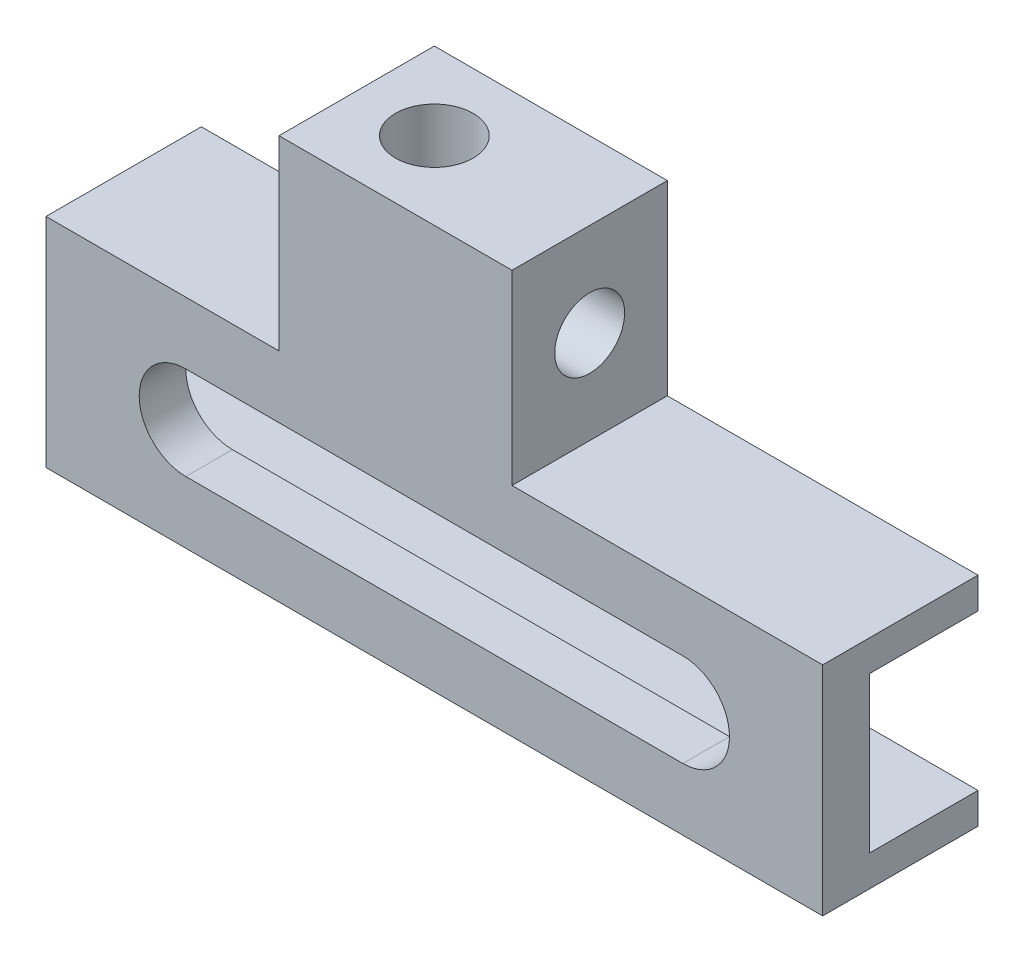
ISO-10303-21;
HEADER;
FILE_DESCRIPTION(('STEP AP214'),'2;1');
FILE_NAME('part.step','',(''),(''),'','','');
FILE_SCHEMA(('AUTOMOTIVE_DESIGN { 1 0 10303 214 1 1 1 1 }'));
ENDSEC;
DATA;
#1=APPLICATION_CONTEXT('core data for automotive mechanical design processes');
#2=APPLICATION_PROTOCOL_DEFINITION('international standard','automotive_design',2000,#1);
#3=PRODUCT_CONTEXT('',#1,'mechanical');
#4=PRODUCT('Part','Part','',(#3));
#5=PRODUCT_RELATED_PRODUCT_CATEGORY('part','',(#4));
#6=PRODUCT_DEFINITION_FORMATION('','',#4);
#7=PRODUCT_DEFINITION_CONTEXT('part definition',#1,'design');
#8=PRODUCT_DEFINITION('design','',#6,#7);
#9=PRODUCT_DEFINITION_SHAPE('','',#8);
#10=(LENGTH_UNIT() NAMED_UNIT(*) SI_UNIT(.MILLI.,.METRE.));
#11=(NAMED_UNIT(*) PLANE_ANGLE_UNIT() SI_UNIT($,.RADIAN.));
#12=(NAMED_UNIT(*) SI_UNIT($,.STERADIAN.) SOLID_ANGLE_UNIT());
#13=UNCERTAINTY_MEASURE_WITH_UNIT(LENGTH_MEASURE(1.E-05),#10,'distance_accuracy_value','');
#14=(GEOMETRIC_REPRESENTATION_CONTEXT(3) GLOBAL_UNCERTAINTY_ASSIGNED_CONTEXT((#13)) GLOBAL_UNIT_ASSIGNED_CONTEXT((#10,
#11,#12)) REPRESENTATION_CONTEXT('',''));
#15=CARTESIAN_POINT('',(0.,0.,0.));
#16=DIRECTION('',(0.,0.,1.));
#17=DIRECTION('',(1.,0.,0.));
#18=AXIS2_PLACEMENT_3D('',#15,#16,#17);
#19=CARTESIAN_POINT('',(50.,7.,0.));
#20=DIRECTION('',(0.,-1.,0.));
#21=DIRECTION('',(0.,0.,-1.));
#22=AXIS2_PLACEMENT_3D('',#19,#20,#21);
#23=PLANE('',#22);
#24=DIRECTION('',(0.,0.,1.));
#25=VECTOR('',#24,1.);
#26=CARTESIAN_POINT('',(15.,7.,-10.));
#27=LINE('',#26,#25);
#28=CARTESIAN_POINT('',(15.,7.,-10.));
#29=VERTEX_POINT('',#28);
#30=CARTESIAN_POINT('',(15.,7.,0.));
#31=VERTEX_POINT('',#30);
#32=EDGE_CURVE('E46',#29,#31,#27,.T.);
#33=ORIENTED_EDGE('',*,*,#32,.F.);
#34=DIRECTION('',(-1.,0.,0.));
#35=VECTOR('',#34,1.);
#36=CARTESIAN_POINT('',(50.,7.,-10.));
#37=LINE('',#36,#35);
#38=CARTESIAN_POINT('',(0.,7.,-10.));
#39=VERTEX_POINT('',#38);
#40=EDGE_CURVE('E219',#29,#39,#37,.T.);
#41=ORIENTED_EDGE('',*,*,#40,.T.);
#42=DIRECTION('',(0.,0.,1.));
#43=VECTOR('',#42,1.);
#44=CARTESIAN_POINT('',(0.,7.,0.));
#45=LINE('',#44,#43);
#46=CARTESIAN_POINT('',(0.,7.,0.));
#47=VERTEX_POINT('',#46);
#48=EDGE_CURVE('E194',#39,#47,#45,.T.);
#49=ORIENTED_EDGE('',*,*,#48,.T.);
#50=DIRECTION('',(-1.,0.,0.));
#51=VECTOR('',#50,1.);
#52=CARTESIAN_POINT('',(50.,7.,0.));
#53=LINE('',#52,#51);
#54=EDGE_CURVE('E39',#31,#47,#53,.T.);
#55=ORIENTED_EDGE('',*,*,#54,.F.);
#56=EDGE_LOOP('',(#33,#41,#49,#55));
#57=FACE_BOUND('',#56,.T.);
#58=ADVANCED_FACE('F32',(#57),#23,.F.);
#59=DIRECTION('',(0.,0.,-1.));
#60=VECTOR('',#59,1.);
#61=CARTESIAN_POINT('',(30.,7.,-10.));
#62=LINE('',#61,#60);
#63=CARTESIAN_POINT('',(30.,7.,0.));
#64=VERTEX_POINT('',#63);
#65=CARTESIAN_POINT('',(30.,7.,-10.));
#66=VERTEX_POINT('',#65);
#67=EDGE_CURVE('E160',#64,#66,#62,.T.);
#68=ORIENTED_EDGE('',*,*,#67,.F.);
#69=CARTESIAN_POINT('',(50.,7.,0.));
#70=VERTEX_POINT('',#69);
#71=EDGE_CURVE('E11',#70,#64,#53,.T.);
#72=ORIENTED_EDGE('',*,*,#71,.F.);
#73=DIRECTION('',(0.,0.,1.));
#74=VECTOR('',#73,1.);
#75=CARTESIAN_POINT('',(50.,7.,0.));
#76=LINE('',#75,#74);
#77=CARTESIAN_POINT('',(50.,7.,-10.));
#78=VERTEX_POINT('',#77);
#79=EDGE_CURVE('E201',#78,#70,#76,.T.);
#80=ORIENTED_EDGE('',*,*,#79,.F.);
#81=EDGE_CURVE('E235',#78,#66,#37,.T.);
#82=ORIENTED_EDGE('',*,*,#81,.T.);
#83=EDGE_LOOP('',(#68,#72,#80,#82));
#84=FACE_BOUND('',#83,.T.);
#85=ADVANCED_FACE('F305',(#84),#23,.F.);
#86=CARTESIAN_POINT('',(50.,-7.,0.));
#87=DIRECTION('',(0.,0.,-1.));
#88=DIRECTION('',(-1.,0.,0.));
#89=AXIS2_PLACEMENT_3D('',#86,#87,#88);
#90=PLANE('',#89);
#91=DIRECTION('',(1.,0.,0.));
#92=VECTOR('',#91,1.);
#93=CARTESIAN_POINT('',(41.,3.,0.));
#94=LINE('',#93,#92);
#95=CARTESIAN_POINT('',(9.,3.,0.));
#96=VERTEX_POINT('',#95);
#97=CARTESIAN_POINT('',(41.,3.,0.));
#98=VERTEX_POINT('',#97);
#99=EDGE_CURVE('E181',#96,#98,#94,.T.);
#100=ORIENTED_EDGE('',*,*,#99,.T.);
#101=CARTESIAN_POINT('',(41.,0.,0.));
#102=DIRECTION('',(0.,0.,-1.));
#103=DIRECTION('',(0.,1.,0.));
#104=AXIS2_PLACEMENT_3D('',#101,#102,#103);
#105=CIRCLE('',#104,3.);
#106=CARTESIAN_POINT('',(41.,-3.,0.));
#107=VERTEX_POINT('',#106);
#108=EDGE_CURVE('E171',#98,#107,#105,.T.);
#109=ORIENTED_EDGE('',*,*,#108,.T.);
#110=DIRECTION('',(-1.,0.,0.));
#111=VECTOR('',#110,1.);
#112=CARTESIAN_POINT('',(41.,-3.,0.));
#113=LINE('',#112,#111);
#114=CARTESIAN_POINT('',(9.,-3.,0.));
#115=VERTEX_POINT('',#114);
#116=EDGE_CURVE('E174',#107,#115,#113,.T.);
#117=ORIENTED_EDGE('',*,*,#116,.T.);
#118=CARTESIAN_POINT('',(9.,0.,0.));
#119=DIRECTION('',(0.,0.,-1.));
#120=DIRECTION('',(0.,1.,0.));
#121=AXIS2_PLACEMENT_3D('',#118,#119,#120);
#122=CIRCLE('',#121,3.);
#123=EDGE_CURVE('E178',#115,#96,#122,.T.);
#124=ORIENTED_EDGE('',*,*,#123,.T.);
#125=EDGE_LOOP('',(#100,#109,#117,#124));
#126=FACE_BOUND('',#125,.T.);
#127=DIRECTION('',(0.,-1.,0.));
#128=VECTOR('',#127,1.);
#129=CARTESIAN_POINT('',(0.,-7.,0.));
#130=LINE('',#129,#128);
#131=CARTESIAN_POINT('',(0.,-7.,0.));
#132=VERTEX_POINT('',#131);
#133=EDGE_CURVE('E221',#47,#132,#130,.T.);
#134=ORIENTED_EDGE('',*,*,#133,.T.);
#135=DIRECTION('',(-1.,0.,0.));
#136=VECTOR('',#135,1.);
#137=CARTESIAN_POINT('',(50.,-7.,0.));
#138=LINE('',#137,#136);
#139=CARTESIAN_POINT('',(50.,-7.,0.));
#140=VERTEX_POINT('',#139);
#141=EDGE_CURVE('E251',#140,#132,#138,.T.);
#142=ORIENTED_EDGE('',*,*,#141,.F.);
#143=DIRECTION('',(0.,-1.,0.));
#144=VECTOR('',#143,1.);
#145=CARTESIAN_POINT('',(50.,-7.,0.));
#146=LINE('',#145,#144);
#147=EDGE_CURVE('E204',#70,#140,#146,.T.);
#148=ORIENTED_EDGE('',*,*,#147,.F.);
#149=ORIENTED_EDGE('',*,*,#71,.T.);
#150=DIRECTION('',(0.,-1.,0.));
#151=VECTOR('',#150,1.);
#152=CARTESIAN_POINT('',(30.,19.,0.));
#153=LINE('',#152,#151);
#154=CARTESIAN_POINT('',(30.,19.,0.));
#155=VERTEX_POINT('',#154);
#156=EDGE_CURVE('E147',#155,#64,#153,.T.);
#157=ORIENTED_EDGE('',*,*,#156,.F.);
#158=DIRECTION('',(1.,0.,0.));
#159=VECTOR('',#158,1.);
#160=CARTESIAN_POINT('',(15.,19.,0.));
#161=LINE('',#160,#159);
#162=CARTESIAN_POINT('',(15.,19.,0.));
#163=VERTEX_POINT('',#162);
#164=EDGE_CURVE('E141',#163,#155,#161,.T.);
#165=ORIENTED_EDGE('',*,*,#164,.F.);
#166=DIRECTION('',(0.,-1.,0.));
#167=VECTOR('',#166,1.);
#168=CARTESIAN_POINT('',(15.,19.,0.));
#169=LINE('',#168,#167);
#170=EDGE_CURVE('E145',#163,#31,#169,.T.);
#171=ORIENTED_EDGE('',*,*,#170,.T.);
#172=ORIENTED_EDGE('',*,*,#54,.T.);
#173=EDGE_LOOP('',(#134,#142,#148,#149,#157,#165,#171,#172));
#174=FACE_BOUND('',#173,.T.);
#175=ADVANCED_FACE('F143',(#126,#174),#90,.F.);
#176=CARTESIAN_POINT('',(50.,-7.,0.));
#177=DIRECTION('',(0.,1.,0.));
#178=DIRECTION('',(0.,0.,1.));
#179=AXIS2_PLACEMENT_3D('',#176,#177,#178);
#180=PLANE('',#179);
#181=DIRECTION('',(0.,0.,-1.));
#182=VECTOR('',#181,1.);
#183=CARTESIAN_POINT('',(0.,-7.,0.));
#184=LINE('',#183,#182);
#185=CARTESIAN_POINT('',(0.,-7.,-10.));
#186=VERTEX_POINT('',#185);
#187=EDGE_CURVE('E223',#132,#186,#184,.T.);
#188=ORIENTED_EDGE('',*,*,#187,.T.);
#189=DIRECTION('',(-1.,0.,0.));
#190=VECTOR('',#189,1.);
#191=CARTESIAN_POINT('',(50.,-7.,-10.));
#192=LINE('',#191,#190);
#193=CARTESIAN_POINT('',(50.,-7.,-10.));
#194=VERTEX_POINT('',#193);
#195=EDGE_CURVE('E249',#194,#186,#192,.T.);
#196=ORIENTED_EDGE('',*,*,#195,.F.);
#197=DIRECTION('',(0.,0.,-1.));
#198=VECTOR('',#197,1.);
#199=CARTESIAN_POINT('',(50.,-7.,0.));
#200=LINE('',#199,#198);
#201=EDGE_CURVE('E207',#140,#194,#200,.T.);
#202=ORIENTED_EDGE('',*,*,#201,.F.);
#203=ORIENTED_EDGE('',*,*,#141,.T.);
#204=EDGE_LOOP('',(#188,#196,#202,#203));
#205=FACE_BOUND('',#204,.T.);
#206=ADVANCED_FACE('F286',(#205),#180,.F.);
#207=CARTESIAN_POINT('',(50.,-7.,-10.));
#208=DIRECTION('',(0.,0.,1.));
#209=DIRECTION('',(1.,0.,0.));
#210=AXIS2_PLACEMENT_3D('',#207,#208,#209);
#211=PLANE('',#210);
#212=DIRECTION('',(0.,1.,0.));
#213=VECTOR('',#212,1.);
#214=CARTESIAN_POINT('',(0.,-7.,-10.));
#215=LINE('',#214,#213);
#216=CARTESIAN_POINT('',(0.,-5.,-10.));
#217=VERTEX_POINT('',#216);
#218=EDGE_CURVE('E225',#186,#217,#215,.T.);
#219=ORIENTED_EDGE('',*,*,#218,.T.);
#220=DIRECTION('',(-1.,0.,0.));
#221=VECTOR('',#220,1.);
#222=CARTESIAN_POINT('',(50.,-5.,-10.));
#223=LINE('',#222,#221);
#224=CARTESIAN_POINT('',(50.,-5.,-10.));
#225=VERTEX_POINT('',#224);
#226=EDGE_CURVE('E246',#225,#217,#223,.T.);
#227=ORIENTED_EDGE('',*,*,#226,.F.);
#228=DIRECTION('',(0.,1.,0.));
#229=VECTOR('',#228,1.);
#230=CARTESIAN_POINT('',(50.,-7.,-10.));
#231=LINE('',#230,#229);
#232=EDGE_CURVE('E209',#194,#225,#231,.T.);
#233=ORIENTED_EDGE('',*,*,#232,.F.);
#234=ORIENTED_EDGE('',*,*,#195,.T.);
#235=EDGE_LOOP('',(#219,#227,#233,#234));
#236=FACE_BOUND('',#235,.T.);
#237=ADVANCED_FACE('F283',(#236),#211,.F.);
#238=CARTESIAN_POINT('',(50.,-5.,-10.));
#239=DIRECTION('',(0.,-1.,0.));
#240=DIRECTION('',(0.,0.,-1.));
#241=AXIS2_PLACEMENT_3D('',#238,#239,#240);
#242=PLANE('',#241);
#243=DIRECTION('',(0.,0.,1.));
#244=VECTOR('',#243,1.);
#245=CARTESIAN_POINT('',(0.,-5.,-10.));
#246=LINE('',#245,#244);
#247=CARTESIAN_POINT('',(0.,-5.,-3.));
#248=VERTEX_POINT('',#247);
#249=EDGE_CURVE('E227',#217,#248,#246,.T.);
#250=ORIENTED_EDGE('',*,*,#249,.T.);
#251=DIRECTION('',(-1.,0.,0.));
#252=VECTOR('',#251,1.);
#253=CARTESIAN_POINT('',(50.,-5.,-3.));
#254=LINE('',#253,#252);
#255=CARTESIAN_POINT('',(50.,-5.,-3.));
#256=VERTEX_POINT('',#255);
#257=EDGE_CURVE('E243',#256,#248,#254,.T.);
#258=ORIENTED_EDGE('',*,*,#257,.F.);
#259=DIRECTION('',(0.,0.,1.));
#260=VECTOR('',#259,1.);
#261=CARTESIAN_POINT('',(50.,-5.,-10.));
#262=LINE('',#261,#260);
#263=EDGE_CURVE('E211',#225,#256,#262,.T.);
#264=ORIENTED_EDGE('',*,*,#263,.F.);
#265=ORIENTED_EDGE('',*,*,#226,.T.);
#266=EDGE_LOOP('',(#250,#258,#264,#265));
#267=FACE_BOUND('',#266,.T.);
#268=ADVANCED_FACE('F280',(#267),#242,.F.);
#269=CARTESIAN_POINT('',(50.,5.,-3.));
#270=DIRECTION('',(0.,0.,1.));
#271=DIRECTION('',(0.,-1.,0.));
#272=AXIS2_PLACEMENT_3D('',#269,#270,#271);
#273=PLANE('',#272);
#274=DIRECTION('',(-1.,0.,0.));
#275=VECTOR('',#274,1.);
#276=CARTESIAN_POINT('',(41.,-3.,-3.));
#277=LINE('',#276,#275);
#278=CARTESIAN_POINT('',(41.,-3.,-3.));
#279=VERTEX_POINT('',#278);
#280=CARTESIAN_POINT('',(9.,-3.,-3.));
#281=VERTEX_POINT('',#280);
#282=EDGE_CURVE('E165',#279,#281,#277,.T.);
#283=ORIENTED_EDGE('',*,*,#282,.F.);
#284=CARTESIAN_POINT('',(41.,0.,-3.));
#285=DIRECTION('',(0.,0.,-1.));
#286=DIRECTION('',(0.,1.,0.));
#287=AXIS2_PLACEMENT_3D('',#284,#285,#286);
#288=CIRCLE('',#287,3.);
#289=CARTESIAN_POINT('',(41.,3.,-3.));
#290=VERTEX_POINT('',#289);
#291=EDGE_CURVE('E163',#290,#279,#288,.T.);
#292=ORIENTED_EDGE('',*,*,#291,.F.);
#293=DIRECTION('',(1.,0.,0.));
#294=VECTOR('',#293,1.);
#295=CARTESIAN_POINT('',(41.,3.,-3.));
#296=LINE('',#295,#294);
#297=CARTESIAN_POINT('',(9.,3.,-3.));
#298=VERTEX_POINT('',#297);
#299=EDGE_CURVE('E175',#298,#290,#296,.T.);
#300=ORIENTED_EDGE('',*,*,#299,.F.);
#301=CARTESIAN_POINT('',(9.,0.,-3.));
#302=DIRECTION('',(0.,0.,-1.));
#303=DIRECTION('',(0.,1.,0.));
#304=AXIS2_PLACEMENT_3D('',#301,#302,#303);
#305=CIRCLE('',#304,3.);
#306=EDGE_CURVE('E187',#281,#298,#305,.T.);
#307=ORIENTED_EDGE('',*,*,#306,.F.);
#308=EDGE_LOOP('',(#283,#292,#300,#307));
#309=FACE_BOUND('',#308,.T.);
#310=DIRECTION('',(0.,1.,0.));
#311=VECTOR('',#310,1.);
#312=CARTESIAN_POINT('',(0.,5.,-3.));
#313=LINE('',#312,#311);
#314=CARTESIAN_POINT('',(0.,5.,-3.));
#315=VERTEX_POINT('',#314);
#316=EDGE_CURVE('E229',#248,#315,#313,.T.);
#317=ORIENTED_EDGE('',*,*,#316,.T.);
#318=DIRECTION('',(-1.,0.,0.));
#319=VECTOR('',#318,1.);
#320=CARTESIAN_POINT('',(50.,5.,-3.));
#321=LINE('',#320,#319);
#322=CARTESIAN_POINT('',(50.,5.,-3.));
#323=VERTEX_POINT('',#322);
#324=EDGE_CURVE('E240',#323,#315,#321,.T.);
#325=ORIENTED_EDGE('',*,*,#324,.F.);
#326=DIRECTION('',(0.,1.,0.));
#327=VECTOR('',#326,1.);
#328=CARTESIAN_POINT('',(50.,5.,-3.));
#329=LINE('',#328,#327);
#330=EDGE_CURVE('E213',#256,#323,#329,.T.);
#331=ORIENTED_EDGE('',*,*,#330,.F.);
#332=ORIENTED_EDGE('',*,*,#257,.T.);
#333=EDGE_LOOP('',(#317,#325,#331,#332));
#334=FACE_BOUND('',#333,.T.);
#335=ADVANCED_FACE('F276',(#309,#334),#273,.F.);
#336=CARTESIAN_POINT('',(50.,5.,-10.));
#337=DIRECTION('',(0.,1.,0.));
#338=DIRECTION('',(0.,0.,1.));
#339=AXIS2_PLACEMENT_3D('',#336,#337,#338);
#340=PLANE('',#339);
#341=DIRECTION('',(0.,0.,-1.));
#342=VECTOR('',#341,1.);
#343=CARTESIAN_POINT('',(0.,5.,-10.));
#344=LINE('',#343,#342);
#345=CARTESIAN_POINT('',(0.,5.,-10.));
#346=VERTEX_POINT('',#345);
#347=EDGE_CURVE('E231',#315,#346,#344,.T.);
#348=ORIENTED_EDGE('',*,*,#347,.T.);
#349=DIRECTION('',(-1.,0.,0.));
#350=VECTOR('',#349,1.);
#351=CARTESIAN_POINT('',(50.,5.,-10.));
#352=LINE('',#351,#350);
#353=CARTESIAN_POINT('',(50.,5.,-10.));
#354=VERTEX_POINT('',#353);
#355=EDGE_CURVE('E237',#354,#346,#352,.T.);
#356=ORIENTED_EDGE('',*,*,#355,.F.);
#357=DIRECTION('',(0.,0.,-1.));
#358=VECTOR('',#357,1.);
#359=CARTESIAN_POINT('',(50.,5.,-10.));
#360=LINE('',#359,#358);
#361=EDGE_CURVE('E215',#323,#354,#360,.T.);
#362=ORIENTED_EDGE('',*,*,#361,.F.);
#363=ORIENTED_EDGE('',*,*,#324,.T.);
#364=EDGE_LOOP('',(#348,#356,#362,#363));
#365=FACE_BOUND('',#364,.T.);
#366=ADVANCED_FACE('F271',(#365),#340,.F.);
#367=CARTESIAN_POINT('',(50.,7.,-10.));
#368=DIRECTION('',(0.,0.,1.));
#369=DIRECTION('',(1.,0.,0.));
#370=AXIS2_PLACEMENT_3D('',#367,#368,#369);
#371=PLANE('',#370);
#372=DIRECTION('',(0.,1.,0.));
#373=VECTOR('',#372,1.);
#374=CARTESIAN_POINT('',(0.,7.,-10.));
#375=LINE('',#374,#373);
#376=EDGE_CURVE('E205',#346,#39,#375,.T.);
#377=ORIENTED_EDGE('',*,*,#376,.T.);
#378=ORIENTED_EDGE('',*,*,#40,.F.);
#379=DIRECTION('',(0.,-1.,0.));
#380=VECTOR('',#379,1.);
#381=CARTESIAN_POINT('',(15.,19.,-10.));
#382=LINE('',#381,#380);
#383=CARTESIAN_POINT('',(15.,19.,-10.));
#384=VERTEX_POINT('',#383);
#385=EDGE_CURVE('E298',#384,#29,#382,.T.);
#386=ORIENTED_EDGE('',*,*,#385,.F.);
#387=DIRECTION('',(-1.,0.,0.));
#388=VECTOR('',#387,1.);
#389=CARTESIAN_POINT('',(15.,19.,-10.));
#390=LINE('',#389,#388);
#391=CARTESIAN_POINT('',(30.,19.,-10.));
#392=VERTEX_POINT('',#391);
#393=EDGE_CURVE('E156',#392,#384,#390,.T.);
#394=ORIENTED_EDGE('',*,*,#393,.F.);
#395=DIRECTION('',(0.,-1.,0.));
#396=VECTOR('',#395,1.);
#397=CARTESIAN_POINT('',(30.,19.,-10.));
#398=LINE('',#397,#396);
#399=EDGE_CURVE('E167',#392,#66,#398,.T.);
#400=ORIENTED_EDGE('',*,*,#399,.T.);
#401=ORIENTED_EDGE('',*,*,#81,.F.);
#402=DIRECTION('',(0.,1.,0.));
#403=VECTOR('',#402,1.);
#404=CARTESIAN_POINT('',(50.,7.,-10.));
#405=LINE('',#404,#403);
#406=EDGE_CURVE('E217',#354,#78,#405,.T.);
#407=ORIENTED_EDGE('',*,*,#406,.F.);
#408=ORIENTED_EDGE('',*,*,#355,.T.);
#409=EDGE_LOOP('',(#377,#378,#386,#394,#400,#401,#407,#408));
#410=FACE_BOUND('',#409,.T.);
#411=ADVANCED_FACE('F264',(#410),#371,.F.);
#412=CARTESIAN_POINT('',(50.,0.,0.));
#413=DIRECTION('',(-1.,0.,0.));
#414=DIRECTION('',(0.,0.,1.));
#415=AXIS2_PLACEMENT_3D('',#412,#413,#414);
#416=PLANE('',#415);
#417=ORIENTED_EDGE('',*,*,#79,.T.);
#418=ORIENTED_EDGE('',*,*,#147,.T.);
#419=ORIENTED_EDGE('',*,*,#201,.T.);
#420=ORIENTED_EDGE('',*,*,#232,.T.);
#421=ORIENTED_EDGE('',*,*,#263,.T.);
#422=ORIENTED_EDGE('',*,*,#330,.T.);
#423=ORIENTED_EDGE('',*,*,#361,.T.);
#424=ORIENTED_EDGE('',*,*,#406,.T.);
#425=EDGE_LOOP('',(#417,#418,#419,#420,#421,#422,#423,#424));
#426=FACE_BOUND('',#425,.T.);
#427=ADVANCED_FACE('F288',(#426),#416,.F.);
#428=CARTESIAN_POINT('',(0.,0.,0.));
#429=DIRECTION('',(-1.,0.,0.));
#430=DIRECTION('',(0.,0.,1.));
#431=AXIS2_PLACEMENT_3D('',#428,#429,#430);
#432=PLANE('',#431);
#433=ORIENTED_EDGE('',*,*,#48,.F.);
#434=ORIENTED_EDGE('',*,*,#376,.F.);
#435=ORIENTED_EDGE('',*,*,#347,.F.);
#436=ORIENTED_EDGE('',*,*,#316,.F.);
#437=ORIENTED_EDGE('',*,*,#249,.F.);
#438=ORIENTED_EDGE('',*,*,#218,.F.);
#439=ORIENTED_EDGE('',*,*,#187,.F.);
#440=ORIENTED_EDGE('',*,*,#133,.F.);
#441=EDGE_LOOP('',(#433,#434,#435,#436,#437,#438,#439,#440));
#442=FACE_BOUND('',#441,.T.);
#443=ADVANCED_FACE('F260',(#442),#432,.T.);
#444=CARTESIAN_POINT('',(41.,0.,0.));
#445=DIRECTION('',(0.,0.,-1.));
#446=DIRECTION('',(0.,1.,0.));
#447=AXIS2_PLACEMENT_3D('',#444,#445,#446);
#448=CYLINDRICAL_SURFACE('',#447,3.);
#449=ORIENTED_EDGE('',*,*,#291,.T.);
#450=DIRECTION('',(0.,0.,-1.));
#451=VECTOR('',#450,1.);
#452=CARTESIAN_POINT('',(41.,-3.,0.));
#453=LINE('',#452,#451);
#454=EDGE_CURVE('E183',#107,#279,#453,.T.);
#455=ORIENTED_EDGE('',*,*,#454,.F.);
#456=ORIENTED_EDGE('',*,*,#108,.F.);
#457=DIRECTION('',(0.,0.,-1.));
#458=VECTOR('',#457,1.);
#459=CARTESIAN_POINT('',(41.,3.,0.));
#460=LINE('',#459,#458);
#461=EDGE_CURVE('E192',#98,#290,#460,.T.);
#462=ORIENTED_EDGE('',*,*,#461,.T.);
#463=EDGE_LOOP('',(#449,#455,#456,#462));
#464=FACE_BOUND('',#463,.T.);
#465=ADVANCED_FACE('F432',(#464),#448,.F.);
#466=CARTESIAN_POINT('',(41.,3.,0.));
#467=DIRECTION('',(0.,1.,0.));
#468=DIRECTION('',(0.,0.,1.));
#469=AXIS2_PLACEMENT_3D('',#466,#467,#468);
#470=PLANE('',#469);
#471=ORIENTED_EDGE('',*,*,#299,.T.);
#472=ORIENTED_EDGE('',*,*,#461,.F.);
#473=ORIENTED_EDGE('',*,*,#99,.F.);
#474=DIRECTION('',(0.,0.,-1.));
#475=VECTOR('',#474,1.);
#476=CARTESIAN_POINT('',(9.,3.,0.));
#477=LINE('',#476,#475);
#478=EDGE_CURVE('E195',#96,#298,#477,.T.);
#479=ORIENTED_EDGE('',*,*,#478,.T.);
#480=EDGE_LOOP('',(#471,#472,#473,#479));
#481=FACE_BOUND('',#480,.T.);
#482=ADVANCED_FACE('F428',(#481),#470,.F.);
#483=CARTESIAN_POINT('',(9.,0.,0.));
#484=DIRECTION('',(0.,0.,-1.));
#485=DIRECTION('',(0.,1.,0.));
#486=AXIS2_PLACEMENT_3D('',#483,#484,#485);
#487=CYLINDRICAL_SURFACE('',#486,3.);
#488=ORIENTED_EDGE('',*,*,#306,.T.);
#489=ORIENTED_EDGE('',*,*,#478,.F.);
#490=ORIENTED_EDGE('',*,*,#123,.F.);
#491=DIRECTION('',(0.,0.,-1.));
#492=VECTOR('',#491,1.);
#493=CARTESIAN_POINT('',(9.,-3.,0.));
#494=LINE('',#493,#492);
#495=EDGE_CURVE('E197',#115,#281,#494,.T.);
#496=ORIENTED_EDGE('',*,*,#495,.T.);
#497=EDGE_LOOP('',(#488,#489,#490,#496));
#498=FACE_BOUND('',#497,.T.);
#499=ADVANCED_FACE('F431',(#498),#487,.F.);
#500=CARTESIAN_POINT('',(41.,-3.,0.));
#501=DIRECTION('',(0.,-1.,0.));
#502=DIRECTION('',(0.,0.,-1.));
#503=AXIS2_PLACEMENT_3D('',#500,#501,#502);
#504=PLANE('',#503);
#505=ORIENTED_EDGE('',*,*,#282,.T.);
#506=ORIENTED_EDGE('',*,*,#495,.F.);
#507=ORIENTED_EDGE('',*,*,#116,.F.);
#508=ORIENTED_EDGE('',*,*,#454,.T.);
#509=EDGE_LOOP('',(#505,#506,#507,#508));
#510=FACE_BOUND('',#509,.T.);
#511=ADVANCED_FACE('F321',(#510),#504,.F.);
#512=CARTESIAN_POINT('',(15.,19.,-10.));
#513=DIRECTION('',(1.,0.,0.));
#514=DIRECTION('',(0.,0.,-1.));
#515=AXIS2_PLACEMENT_3D('',#512,#513,#514);
#516=PLANE('',#515);
#517=ORIENTED_EDGE('',*,*,#32,.T.);
#518=ORIENTED_EDGE('',*,*,#170,.F.);
#519=DIRECTION('',(0.,0.,1.));
#520=VECTOR('',#519,1.);
#521=CARTESIAN_POINT('',(15.,19.,-10.));
#522=LINE('',#521,#520);
#523=EDGE_CURVE('E151',#384,#163,#522,.T.);
#524=ORIENTED_EDGE('',*,*,#523,.F.);
#525=ORIENTED_EDGE('',*,*,#385,.T.);
#526=EDGE_LOOP('',(#517,#518,#524,#525));
#527=FACE_BOUND('',#526,.T.);
#528=ADVANCED_FACE('F162',(#527),#516,.F.);
#529=CARTESIAN_POINT('',(30.,19.,-10.));
#530=DIRECTION('',(-1.,0.,0.));
#531=DIRECTION('',(0.,0.,1.));
#532=AXIS2_PLACEMENT_3D('',#529,#530,#531);
#533=PLANE('',#532);
#534=CARTESIAN_POINT('',(30.,13.,-5.));
#535=DIRECTION('',(1.,0.,0.));
#536=DIRECTION('',(0.,0.,-1.));
#537=AXIS2_PLACEMENT_3D('',#534,#535,#536);
#538=CIRCLE('',#537,2.25);
#539=CARTESIAN_POINT('',(30.,13.,-7.25));
#540=VERTEX_POINT('',#539);
#541=EDGE_CURVE('E416',#540,#540,#538,.T.);
#542=ORIENTED_EDGE('',*,*,#541,.F.);
#543=EDGE_LOOP('',(#542));
#544=FACE_BOUND('',#543,.T.);
#545=ORIENTED_EDGE('',*,*,#67,.T.);
#546=ORIENTED_EDGE('',*,*,#399,.F.);
#547=DIRECTION('',(0.,0.,-1.));
#548=VECTOR('',#547,1.);
#549=CARTESIAN_POINT('',(30.,19.,-10.));
#550=LINE('',#549,#548);
#551=EDGE_CURVE('E150',#155,#392,#550,.T.);
#552=ORIENTED_EDGE('',*,*,#551,.F.);
#553=ORIENTED_EDGE('',*,*,#156,.T.);
#554=EDGE_LOOP('',(#545,#546,#552,#553));
#555=FACE_BOUND('',#554,.T.);
#556=ADVANCED_FACE('F294',(#544,#555),#533,.F.);
#557=CARTESIAN_POINT('',(0.,19.,0.));
#558=DIRECTION('',(0.,1.,0.));
#559=DIRECTION('',(0.,0.,1.));
#560=AXIS2_PLACEMENT_3D('',#557,#558,#559);
#561=PLANE('',#560);
#562=CARTESIAN_POINT('',(20.,19.,-5.));
#563=DIRECTION('',(0.,1.,0.));
#564=DIRECTION('',(0.,0.,1.));
#565=AXIS2_PLACEMENT_3D('',#562,#563,#564);
#566=CIRCLE('',#565,2.5);
#567=CARTESIAN_POINT('',(20.,19.,-2.5));
#568=VERTEX_POINT('',#567);
#569=EDGE_CURVE('E415',#568,#568,#566,.T.);
#570=ORIENTED_EDGE('',*,*,#569,.F.);
#571=EDGE_LOOP('',(#570));
#572=FACE_BOUND('',#571,.T.);
#573=ORIENTED_EDGE('',*,*,#523,.T.);
#574=ORIENTED_EDGE('',*,*,#164,.T.);
#575=ORIENTED_EDGE('',*,*,#551,.T.);
#576=ORIENTED_EDGE('',*,*,#393,.T.);
#577=EDGE_LOOP('',(#573,#574,#575,#576));
#578=FACE_BOUND('',#577,.T.);
#579=ADVANCED_FACE('F154',(#572,#578),#561,.T.);
#580=CARTESIAN_POINT('',(20.,9.,-5.));
#581=DIRECTION('',(0.,1.,0.));
#582=DIRECTION('',(0.,0.,1.));
#583=AXIS2_PLACEMENT_3D('',#580,#581,#582);
#584=CYLINDRICAL_SURFACE('',#583,2.5);
#585=CARTESIAN_POINT('',(21.0897247358852,13.,-7.25));
#586=CARTESIAN_POINT('',(21.0897469476033,12.9325997508179,-7.2499935391521));
#587=CARTESIAN_POINT('',(21.0961417218483,12.8651013765811,-7.2469250512076));
#588=CARTESIAN_POINT('',(21.12012854185,12.7325872814394,-7.23505508673235));
#589=CARTESIAN_POINT('',(21.1377653138885,12.6675825818379,-7.22623070710709));
#590=CARTESIAN_POINT('',(21.1912230490049,12.5108098463194,-7.19823867979871));
#591=CARTESIAN_POINT('',(21.2317108127361,12.4212279403674,-7.17613651782381));
#592=CARTESIAN_POINT('',(21.3212569975831,12.2492440419257,-7.12297450107913));
#593=CARTESIAN_POINT('',(21.3703491849841,12.1668723283107,-7.09187902919318));
#594=CARTESIAN_POINT('',(21.4648894094348,12.0196590503502,-7.02655468056096));
#595=CARTESIAN_POINT('',(21.5098423292666,11.9540023268979,-6.99342399682967));
#596=CARTESIAN_POINT('',(21.600694889352,11.8266640363245,-6.92123540270406));
#597=CARTESIAN_POINT('',(21.646595109771,11.7649850067856,-6.88217376090119));
#598=CARTESIAN_POINT('',(21.7379448548364,11.6455921240626,-6.79816443393948));
#599=CARTESIAN_POINT('',(21.7833949355928,11.5878726617021,-6.75322534879853));
#600=CARTESIAN_POINT('',(21.872852807998,11.4764591756815,-6.65732481800722));
#601=CARTESIAN_POINT('',(21.9168605087016,11.4227654055761,-6.60636299353984));
#602=CARTESIAN_POINT('',(22.0244634187265,11.2932953992879,-6.47052119648141));
#603=CARTESIAN_POINT('',(22.0865201075979,11.2203284301129,-6.38165670297684));
#604=CARTESIAN_POINT('',(22.2015101947219,11.086813068391,-6.18987907274174));
#605=CARTESIAN_POINT('',(22.2544592661807,11.0262433067857,-6.08699062803839));
#606=CARTESIAN_POINT('',(22.3383332800385,10.9310139440885,-5.88957175706988));
#607=CARTESIAN_POINT('',(22.3715406872759,10.8936030944334,-5.79735138783976));
#608=CARTESIAN_POINT('',(22.4275175078673,10.8307730259297,-5.60587363555752));
#609=CARTESIAN_POINT('',(22.4502931627875,10.8053466362275,-5.50662050153712));
#610=CARTESIAN_POINT('',(22.4837354014091,10.7680702705012,-5.30292404130682));
#611=CARTESIAN_POINT('',(22.494328829395,10.7563023110962,-5.19845325003731));
#612=CARTESIAN_POINT('',(22.5021785042569,10.7475787475598,-4.98840089970029));
#613=CARTESIAN_POINT('',(22.4994390635862,10.7506183539917,-4.88281971080944));
#614=CARTESIAN_POINT('',(22.4818117907331,10.7702231737481,-4.68446963963422));
#615=CARTESIAN_POINT('',(22.4681299649405,10.7854457585684,-4.59145249046628));
#616=CARTESIAN_POINT('',(22.4311235915779,10.8267660274607,-4.40989111626442));
#617=CARTESIAN_POINT('',(22.4077969731361,10.8528660470798,-4.32134785642176));
#618=CARTESIAN_POINT('',(22.3514078198092,10.9162911232428,-4.14568290689272));
#619=CARTESIAN_POINT('',(22.3178795726704,10.9541555362319,-4.05890849361743));
#620=CARTESIAN_POINT('',(22.2435306705601,11.0387927536951,-3.89327886706019));
#621=CARTESIAN_POINT('',(22.2027076795735,11.0855684121591,-3.81442620325479));
#622=CARTESIAN_POINT('',(22.0925418303812,11.2131653783087,-3.62571484211965));
#623=CARTESIAN_POINT('',(22.0194846001489,11.2989610492547,-3.52133599481564));
#624=CARTESIAN_POINT('',(21.904468792069,11.4378961695309,-3.37927396760866));
#625=CARTESIAN_POINT('',(21.865123300475,11.4860438994717,-3.33424638396527));
#626=CARTESIAN_POINT('',(21.785306991498,11.5855365075357,-3.2489775491052));
#627=CARTESIAN_POINT('',(21.7448366019182,11.6368801791931,-3.20873450822207));
#628=CARTESIAN_POINT('',(21.6625327072124,11.7439278834549,-3.13205297109064));
#629=CARTESIAN_POINT('',(21.6206899491825,11.7997074725255,-3.09573043434064));
#630=CARTESIAN_POINT('',(21.537528754184,11.9146098322439,-3.0279756372115));
#631=CARTESIAN_POINT('',(21.4962106705067,11.9737347230037,-2.99654652650135));
#632=CARTESIAN_POINT('',(21.4155608438226,12.0953553000802,-2.93877800031413));
#633=CARTESIAN_POINT('',(21.3762221678409,12.1578373658211,-2.91241975144389));
#634=CARTESIAN_POINT('',(21.3012871953853,12.2868310404232,-2.86491004619999));
#635=CARTESIAN_POINT('',(21.2656852483517,12.3533363182316,-2.84375066134877));
#636=CARTESIAN_POINT('',(21.2061748730448,12.4803938458257,-2.80999358325281));
#637=CARTESIAN_POINT('',(21.1813090836967,12.540266422065,-2.79657655639242));
#638=CARTESIAN_POINT('',(21.1390787511821,12.663366963341,-2.77445061757229));
#639=CARTESIAN_POINT('',(21.1216929554373,12.7265848410228,-2.76572834863535));
#640=CARTESIAN_POINT('',(21.0972494406247,12.8566358659146,-2.75361374858891));
#641=CARTESIAN_POINT('',(21.0903521431711,12.9235092683968,-2.75030414780311));
#642=CARTESIAN_POINT('',(21.0891810460994,13.0573877520399,-2.74973639943728));
#643=CARTESIAN_POINT('',(21.0949052046043,13.1243928101495,-2.75247727302217));
#644=CARTESIAN_POINT('',(21.1184502951753,13.2615876569446,-2.76410264991223));
#645=CARTESIAN_POINT('',(21.1372790856235,13.3315482976198,-2.7735002730122));
#646=CARTESIAN_POINT('',(21.1840068083458,13.4674313919544,-2.79799752955043));
#647=CARTESIAN_POINT('',(21.2119431724932,13.5333358226052,-2.81312073707825));
#648=CARTESIAN_POINT('',(21.270874355439,13.6559512216883,-2.84687644136302));
#649=CARTESIAN_POINT('',(21.3014480818434,13.7129762992532,-2.86513327895248));
#650=CARTESIAN_POINT('',(21.3654482724209,13.8240130130157,-2.90548569678488));
#651=CARTESIAN_POINT('',(21.398877162704,13.8780220206251,-2.92758455854536));
#652=CARTESIAN_POINT('',(21.5015331158224,14.0361544982703,-2.99941572922886));
#653=CARTESIAN_POINT('',(21.573083906651,14.1362985153918,-3.05465832002515));
#654=CARTESIAN_POINT('',(21.7239073858155,14.337601339576,-3.18635643941131));
#655=CARTESIAN_POINT('',(21.8031701060219,14.4376768280654,-3.26446965187039));
#656=CARTESIAN_POINT('',(21.9561158895008,14.6253659896923,-3.43890042058911));
#657=CARTESIAN_POINT('',(22.0298083812016,14.7130009515932,-3.53518620481));
#658=CARTESIAN_POINT('',(22.1525537890395,14.8566258806374,-3.72464863998947));
#659=CARTESIAN_POINT('',(22.2035612866766,14.9154205163003,-3.81441883526224));
#660=CARTESIAN_POINT('',(22.2960125384001,15.0210962949752,-4.00525195188614));
#661=CARTESIAN_POINT('',(22.3374668448971,15.0679905889018,-4.10630222831143));
#662=CARTESIAN_POINT('',(22.4023229970256,15.1410017822531,-4.30162606998693));
#663=CARTESIAN_POINT('',(22.4275298319075,15.1692158993161,-4.39450900318135));
#664=CARTESIAN_POINT('',(22.4672879881899,15.2136189698068,-4.58531525942827));
#665=CARTESIAN_POINT('',(22.4818460043246,15.2298154785959,-4.68323537416756));
#666=CARTESIAN_POINT('',(22.49919630546,15.2491110104287,-4.88177313518052));
#667=CARTESIAN_POINT('',(22.5019462302495,15.2521628786591,-4.98239919243028));
#668=CARTESIAN_POINT('',(22.4953255272603,15.2448055466613,-5.18275219874889));
#669=CARTESIAN_POINT('',(22.4859541460746,15.2343955097002,-5.28247909154166));
#670=CARTESIAN_POINT('',(22.4567285812333,15.2018318055356,-5.47244915188255));
#671=CARTESIAN_POINT('',(22.4374927370077,15.1803705698836,-5.5629103820551));
#672=CARTESIAN_POINT('',(22.3902069577201,15.1273764446974,-5.73836424934664));
#673=CARTESIAN_POINT('',(22.3621544106726,15.0958405704633,-5.82335525688783));
#674=CARTESIAN_POINT('',(22.2872920912261,15.0111527899102,-6.016110669845));
#675=CARTESIAN_POINT('',(22.2373658503267,14.9543065579643,-6.12104481443649));
#676=CARTESIAN_POINT('',(22.1277796000174,14.8278217758597,-6.31729592046218));
#677=CARTESIAN_POINT('',(22.0680964371932,14.7581527461511,-6.40857947731899));
#678=CARTESIAN_POINT('',(21.9232487461292,14.585652698716,-6.60309175236778));
#679=CARTESIAN_POINT('',(21.8358654814512,14.4791891368094,-6.70146787458899));
#680=CARTESIAN_POINT('',(21.7025288437616,14.3085616458635,-6.83174273769014));
#681=CARTESIAN_POINT('',(21.6576877088103,14.2498377723706,-6.87229906615332));
#682=CARTESIAN_POINT('',(21.568326925852,14.1286429200658,-6.9477571643794));
#683=CARTESIAN_POINT('',(21.523807118683,14.0661739627799,-6.9826619477472));
#684=CARTESIAN_POINT('',(21.4329274859522,13.9318994058757,-7.04942680773017));
#685=CARTESIAN_POINT('',(21.386717926568,13.8597485475612,-7.08079963792332));
#686=CARTESIAN_POINT('',(21.2991576223987,13.7099416879538,-7.13655410253905));
#687=CARTESIAN_POINT('',(21.2578021167456,13.6322912026475,-7.16094262158359));
#688=CARTESIAN_POINT('',(21.1940299135962,13.4910178875955,-7.19665144839708));
#689=CARTESIAN_POINT('',(21.1694698401493,13.4288292178696,-7.20971729149385));
#690=CARTESIAN_POINT('',(21.1289114014884,13.3009356128531,-7.23071552251605));
#691=CARTESIAN_POINT('',(21.1128811062779,13.2352448184437,-7.23866707872132));
#692=CARTESIAN_POINT('',(21.0984185828065,13.1406639203028,-7.24577311514153));
#693=CARTESIAN_POINT('',(21.0951754818526,13.1126567264337,-7.24735352288714));
#694=CARTESIAN_POINT('',(21.0908238968127,13.0564387601601,-7.24946832331148));
#695=CARTESIAN_POINT('',(21.0897154333667,13.0282279857897,-7.25000270587609));
#696=CARTESIAN_POINT('',(21.0897247358852,13.,-7.25));
#697=B_SPLINE_CURVE_WITH_KNOTS('',3,(#585,#586,#587,#588,#589,#590,#591,#592,#593,#594,#595,
#596,#597,#598,#599,#600,#601,#602,#603,#604,#605,#606,#607,#608,#609,#610,#611,#612,#613,#614,
#615,#616,#617,#618,#619,#620,#621,#622,#623,#624,#625,#626,#627,#628,#629,#630,#631,#632,#633,
#634,#635,#636,#637,#638,#639,#640,#641,#642,#643,#644,#645,#646,#647,#648,#649,#650,#651,#652,
#653,#654,#655,#656,#657,#658,#659,#660,#661,#662,#663,#664,#665,#666,#667,#668,#669,#670,#671,
#672,#673,#674,#675,#676,#677,#678,#679,#680,#681,#682,#683,#684,#685,#686,#687,#688,#689,#690,
#691,#692,#693,#694,#695,#696),.UNSPECIFIED.,.T.,.F.,(4,2,2,2,2,2,2,2,2,2,2,2,2,2,2,2,2,2,2,2,2,
2,2,2,2,2,2,2,2,2,2,2,2,2,2,2,2,2,2,2,2,2,2,2,2,2,2,2,2,2,2,2,2,2,2,4),(0.,0.202062849840255,
0.40493466737826,0.705499683800917,1.0072717519134,1.26553407383889,1.52395955763023,
1.78201105126137,2.04007878440909,2.43059025903484,2.82042283276742,3.13390108366375,
3.44719152724317,3.76235365121028,4.07741384425736,4.36186755507656,4.64638237382963,
4.94657725907128,5.24686844935467,5.70495303644712,5.93511251833634,6.16518563599563,
6.40083938034936,6.63664418245707,6.87155553228999,7.10610637766095,7.3042283100989,
7.50178354902221,7.70233103677042,7.90284608267731,8.12078363514642,8.33962844175339,
8.54103483522,8.74261410500543,9.14606783013413,9.59357777898348,10.0403124519226,
10.395498240379,10.7502897913392,11.0498970135522,11.3493157154502,11.6498076558699,
11.9503182744452,12.2339504343514,12.517666700814,12.9036230143007,13.2905088730198,
13.7954322155803,14.0480987714042,14.3006301495301,14.5739519507102,14.847003396562,
15.0508344066286,15.2538969390788,15.3385223250839,15.423148529336),.UNSPECIFIED.);
#698=CARTESIAN_POINT('',(21.0897247358852,13.,-7.25));
#699=VERTEX_POINT('',#698);
#700=EDGE_CURVE('E409',#699,#699,#697,.T.);
#701=ORIENTED_EDGE('',*,*,#700,.F.);
#702=EDGE_LOOP('',(#701));
#703=FACE_BOUND('',#702,.T.);
#704=CARTESIAN_POINT('',(20.,9.,-5.));
#705=DIRECTION('',(0.,1.,0.));
#706=DIRECTION('',(0.,0.,1.));
#707=AXIS2_PLACEMENT_3D('',#704,#705,#706);
#708=CIRCLE('',#707,2.5);
#709=CARTESIAN_POINT('',(20.,9.,-2.5));
#710=VERTEX_POINT('',#709);
#711=EDGE_CURVE('E302',#710,#710,#708,.T.);
#712=ORIENTED_EDGE('',*,*,#711,.F.);
#713=EDGE_LOOP('',(#712));
#714=FACE_BOUND('',#713,.T.);
#715=ORIENTED_EDGE('',*,*,#569,.T.);
#716=EDGE_LOOP('',(#715));
#717=FACE_BOUND('',#716,.T.);
#718=ADVANCED_FACE('F362',(#703,#714,#717),#584,.F.);
#719=CARTESIAN_POINT('',(20.,9.,-5.));
#720=DIRECTION('',(0.,1.,0.));
#721=DIRECTION('',(0.,0.,1.));
#722=AXIS2_PLACEMENT_3D('',#719,#720,#721);
#723=PLANE('',#722);
#724=ORIENTED_EDGE('',*,*,#711,.T.);
#725=EDGE_LOOP('',(#724));
#726=FACE_BOUND('',#725,.T.);
#727=ADVANCED_FACE('F370',(#726),#723,.T.);
#728=CARTESIAN_POINT('',(-0.001000000000001,13.,-5.));
#729=DIRECTION('',(1.,0.,0.));
#730=DIRECTION('',(0.,0.,-1.));
#731=AXIS2_PLACEMENT_3D('',#728,#729,#730);
#732=CYLINDRICAL_SURFACE('',#731,2.25);
#733=ORIENTED_EDGE('',*,*,#700,.T.);
#734=EDGE_LOOP('',(#733));
#735=FACE_BOUND('',#734,.T.);
#736=ORIENTED_EDGE('',*,*,#541,.T.);
#737=EDGE_LOOP('',(#736));
#738=FACE_BOUND('',#737,.T.);
#739=ADVANCED_FACE('F375',(#735,#738),#732,.F.);
#740=CLOSED_SHELL('',(#58,#85,#175,#206,#237,#268,#335,#366,#411,#427,#443,#465,#482,#499,#511,
#528,#556,#579,#718,#727,#739));
#741=MANIFOLD_SOLID_BREP('B2',#740);
#742=ADVANCED_BREP_SHAPE_REPRESENTATION('',(#18,#741),#14);
#743=SHAPE_DEFINITION_REPRESENTATION(#9,#742);
ENDSEC;
END-ISO-10303-21;
